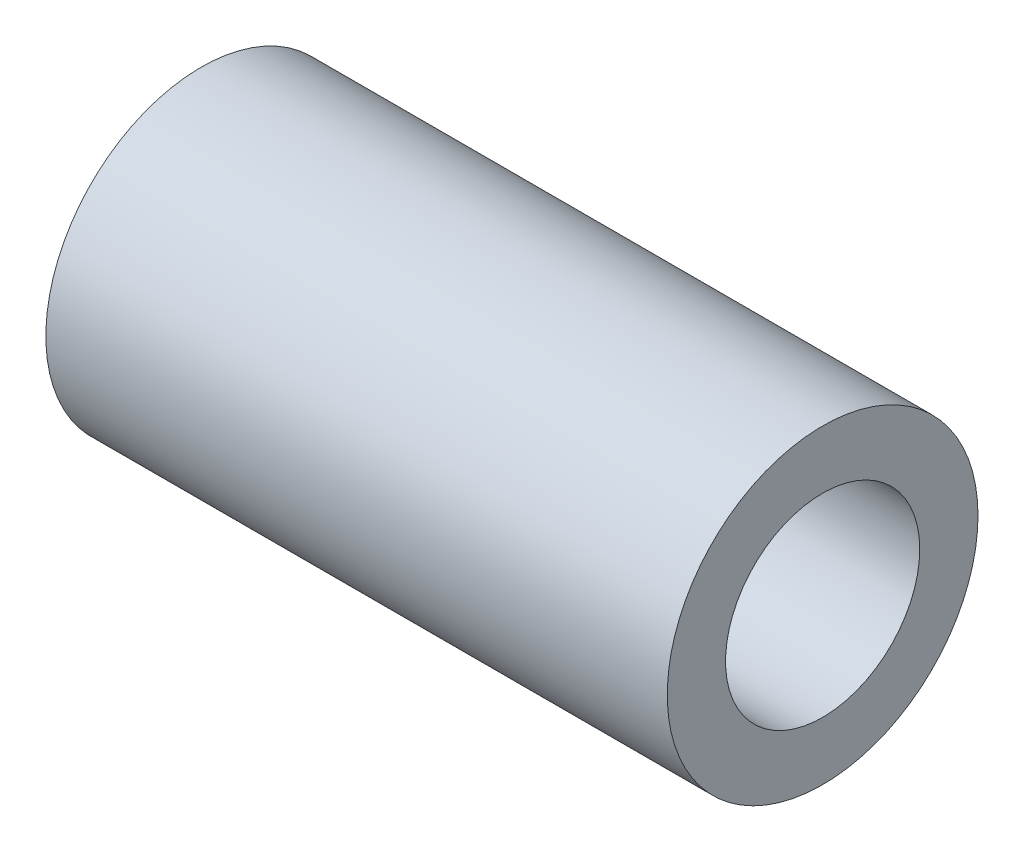
ISO-10303-21;
HEADER;
FILE_DESCRIPTION(('STEP AP214'),'2;1');
FILE_NAME('part.step','',(''),(''),'','','');
FILE_SCHEMA(('AUTOMOTIVE_DESIGN { 1 0 10303 214 1 1 1 1 }'));
ENDSEC;
DATA;
#1=APPLICATION_CONTEXT('core data for automotive mechanical design processes');
#2=APPLICATION_PROTOCOL_DEFINITION('international standard','automotive_design',2000,#1);
#3=PRODUCT_CONTEXT('',#1,'mechanical');
#4=PRODUCT('Part','Part','',(#3));
#5=PRODUCT_RELATED_PRODUCT_CATEGORY('part','',(#4));
#6=PRODUCT_DEFINITION_FORMATION('','',#4);
#7=PRODUCT_DEFINITION_CONTEXT('part definition',#1,'design');
#8=PRODUCT_DEFINITION('design','',#6,#7);
#9=PRODUCT_DEFINITION_SHAPE('','',#8);
#10=(LENGTH_UNIT() NAMED_UNIT(*) SI_UNIT(.MILLI.,.METRE.));
#11=(NAMED_UNIT(*) PLANE_ANGLE_UNIT() SI_UNIT($,.RADIAN.));
#12=(NAMED_UNIT(*) SI_UNIT($,.STERADIAN.) SOLID_ANGLE_UNIT());
#13=UNCERTAINTY_MEASURE_WITH_UNIT(LENGTH_MEASURE(1.E-05),#10,'distance_accuracy_value','');
#14=(GEOMETRIC_REPRESENTATION_CONTEXT(3) GLOBAL_UNCERTAINTY_ASSIGNED_CONTEXT((#13)) GLOBAL_UNIT_ASSIGNED_CONTEXT((#10,
#11,#12)) REPRESENTATION_CONTEXT('',''));
#15=CARTESIAN_POINT('',(0.,0.,0.));
#16=DIRECTION('',(0.,0.,1.));
#17=DIRECTION('',(1.,0.,0.));
#18=AXIS2_PLACEMENT_3D('',#15,#16,#17);
#19=CARTESIAN_POINT('',(8.,0.,0.));
#20=DIRECTION('',(1.,0.,0.));
#21=DIRECTION('',(0.,0.,-1.));
#22=AXIS2_PLACEMENT_3D('',#19,#20,#21);
#23=PLANE('',#22);
#24=CARTESIAN_POINT('',(8.,0.,0.));
#25=DIRECTION('',(1.,0.,0.));
#26=DIRECTION('',(0.,0.,-1.));
#27=AXIS2_PLACEMENT_3D('',#24,#25,#26);
#28=CIRCLE('',#27,2.);
#29=CARTESIAN_POINT('',(8.,0.,-2.));
#30=VERTEX_POINT('',#29);
#31=EDGE_CURVE('E10',#30,#30,#28,.T.);
#32=ORIENTED_EDGE('',*,*,#31,.T.);
#33=EDGE_LOOP('',(#32));
#34=FACE_BOUND('',#33,.T.);
#35=CARTESIAN_POINT('',(8.,0.,0.));
#36=DIRECTION('',(1.,0.,0.));
#37=DIRECTION('',(0.,0.,-1.));
#38=AXIS2_PLACEMENT_3D('',#35,#36,#37);
#39=CIRCLE('',#38,1.25);
#40=CARTESIAN_POINT('',(8.,0.,-1.25));
#41=VERTEX_POINT('',#40);
#42=EDGE_CURVE('E54',#41,#41,#39,.T.);
#43=ORIENTED_EDGE('',*,*,#42,.F.);
#44=EDGE_LOOP('',(#43));
#45=FACE_BOUND('',#44,.T.);
#46=ADVANCED_FACE('F41',(#34,#45),#23,.T.);
#47=CARTESIAN_POINT('',(0.,0.,0.));
#48=DIRECTION('',(1.,0.,0.));
#49=DIRECTION('',(0.,0.,-1.));
#50=AXIS2_PLACEMENT_3D('',#47,#48,#49);
#51=PLANE('',#50);
#52=CARTESIAN_POINT('',(0.,0.,0.));
#53=DIRECTION('',(1.,0.,0.));
#54=DIRECTION('',(0.,0.,-1.));
#55=AXIS2_PLACEMENT_3D('',#52,#53,#54);
#56=CIRCLE('',#55,2.);
#57=CARTESIAN_POINT('',(0.,0.,-2.));
#58=VERTEX_POINT('',#57);
#59=EDGE_CURVE('E45',#58,#58,#56,.T.);
#60=ORIENTED_EDGE('',*,*,#59,.F.);
#61=EDGE_LOOP('',(#60));
#62=FACE_BOUND('',#61,.T.);
#63=CARTESIAN_POINT('',(0.,0.,0.));
#64=DIRECTION('',(1.,0.,0.));
#65=DIRECTION('',(0.,0.,-1.));
#66=AXIS2_PLACEMENT_3D('',#63,#64,#65);
#67=CIRCLE('',#66,1.25);
#68=CARTESIAN_POINT('',(0.,0.,-1.25));
#69=VERTEX_POINT('',#68);
#70=EDGE_CURVE('E56',#69,#69,#67,.T.);
#71=ORIENTED_EDGE('',*,*,#70,.T.);
#72=EDGE_LOOP('',(#71));
#73=FACE_BOUND('',#72,.T.);
#74=ADVANCED_FACE('F68',(#62,#73),#51,.F.);
#75=CARTESIAN_POINT('',(8.,0.,0.));
#76=DIRECTION('',(-1.,0.,0.));
#77=DIRECTION('',(0.,0.,1.));
#78=AXIS2_PLACEMENT_3D('',#75,#76,#77);
#79=CYLINDRICAL_SURFACE('',#78,2.);
#80=ORIENTED_EDGE('',*,*,#31,.F.);
#81=EDGE_LOOP('',(#80));
#82=FACE_BOUND('',#81,.T.);
#83=ORIENTED_EDGE('',*,*,#59,.T.);
#84=EDGE_LOOP('',(#83));
#85=FACE_BOUND('',#84,.T.);
#86=ADVANCED_FACE('F43',(#82,#85),#79,.T.);
#87=CARTESIAN_POINT('',(8.,0.,0.));
#88=DIRECTION('',(-1.,0.,0.));
#89=DIRECTION('',(0.,0.,1.));
#90=AXIS2_PLACEMENT_3D('',#87,#88,#89);
#91=CYLINDRICAL_SURFACE('',#90,1.25);
#92=ORIENTED_EDGE('',*,*,#42,.T.);
#93=EDGE_LOOP('',(#92));
#94=FACE_BOUND('',#93,.T.);
#95=ORIENTED_EDGE('',*,*,#70,.F.);
#96=EDGE_LOOP('',(#95));
#97=FACE_BOUND('',#96,.T.);
#98=ADVANCED_FACE('F64',(#94,#97),#91,.F.);
#99=CLOSED_SHELL('',(#46,#74,#86,#98));
#100=MANIFOLD_SOLID_BREP('B2',#99);
#101=ADVANCED_BREP_SHAPE_REPRESENTATION('',(#18,#100),#14);
#102=SHAPE_DEFINITION_REPRESENTATION(#9,#101);
ENDSEC;
END-ISO-10303-21;
